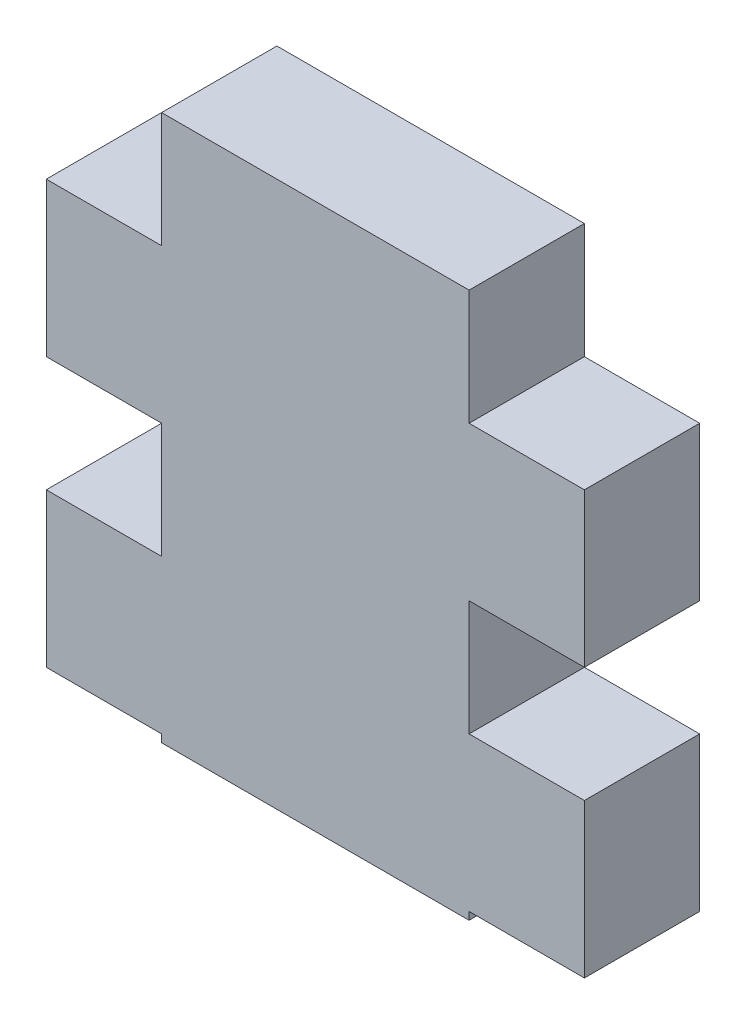
ISO-10303-21;
HEADER;
FILE_DESCRIPTION(('STEP AP214'),'2;1');
FILE_NAME('part.step','',(''),(''),'','','');
FILE_SCHEMA(('AUTOMOTIVE_DESIGN { 1 0 10303 214 1 1 1 1 }'));
ENDSEC;
DATA;
#1=APPLICATION_CONTEXT('core data for automotive mechanical design processes');
#2=APPLICATION_PROTOCOL_DEFINITION('international standard','automotive_design',2000,#1);
#3=PRODUCT_CONTEXT('',#1,'mechanical');
#4=PRODUCT('Part','Part','',(#3));
#5=PRODUCT_RELATED_PRODUCT_CATEGORY('part','',(#4));
#6=PRODUCT_DEFINITION_FORMATION('','',#4);
#7=PRODUCT_DEFINITION_CONTEXT('part definition',#1,'design');
#8=PRODUCT_DEFINITION('design','',#6,#7);
#9=PRODUCT_DEFINITION_SHAPE('','',#8);
#10=(LENGTH_UNIT() NAMED_UNIT(*) SI_UNIT(.MILLI.,.METRE.));
#11=(NAMED_UNIT(*) PLANE_ANGLE_UNIT() SI_UNIT($,.RADIAN.));
#12=(NAMED_UNIT(*) SI_UNIT($,.STERADIAN.) SOLID_ANGLE_UNIT());
#13=UNCERTAINTY_MEASURE_WITH_UNIT(LENGTH_MEASURE(1.E-05),#10,'distance_accuracy_value','');
#14=(GEOMETRIC_REPRESENTATION_CONTEXT(3) GLOBAL_UNCERTAINTY_ASSIGNED_CONTEXT((#13)) GLOBAL_UNIT_ASSIGNED_CONTEXT((#10,
#11,#12)) REPRESENTATION_CONTEXT('',''));
#15=CARTESIAN_POINT('',(0.,0.,0.));
#16=DIRECTION('',(0.,0.,1.));
#17=DIRECTION('',(1.,0.,0.));
#18=AXIS2_PLACEMENT_3D('',#15,#16,#17);
#19=CARTESIAN_POINT('',(7.,-7.1,3.));
#20=DIRECTION('',(-1.,0.,0.));
#21=DIRECTION('',(0.,0.,1.));
#22=AXIS2_PLACEMENT_3D('',#19,#20,#21);
#23=PLANE('',#22);
#24=DIRECTION('',(0.,1.,0.));
#25=VECTOR('',#24,1.);
#26=CARTESIAN_POINT('',(7.,-7.1,0.));
#27=LINE('',#26,#25);
#28=CARTESIAN_POINT('',(7.,-6.9,0.));
#29=VERTEX_POINT('',#28);
#30=CARTESIAN_POINT('',(7.,-2.9,0.));
#31=VERTEX_POINT('',#30);
#32=EDGE_CURVE('E215',#29,#31,#27,.T.);
#33=ORIENTED_EDGE('',*,*,#32,.T.);
#34=DIRECTION('',(0.,0.,1.));
#35=VECTOR('',#34,1.);
#36=CARTESIAN_POINT('',(7.,-2.9,-7.));
#37=LINE('',#36,#35);
#38=CARTESIAN_POINT('',(7.,-2.9,3.));
#39=VERTEX_POINT('',#38);
#40=EDGE_CURVE('E258',#31,#39,#37,.T.);
#41=ORIENTED_EDGE('',*,*,#40,.T.);
#42=DIRECTION('',(0.,1.,0.));
#43=VECTOR('',#42,1.);
#44=CARTESIAN_POINT('',(7.,-7.1,3.));
#45=LINE('',#44,#43);
#46=CARTESIAN_POINT('',(7.,-6.9,3.));
#47=VERTEX_POINT('',#46);
#48=EDGE_CURVE('E198',#47,#39,#45,.T.);
#49=ORIENTED_EDGE('',*,*,#48,.F.);
#50=DIRECTION('',(0.,0.,1.));
#51=VECTOR('',#50,1.);
#52=CARTESIAN_POINT('',(7.,-6.9,-7.));
#53=LINE('',#52,#51);
#54=EDGE_CURVE('E290',#29,#47,#53,.T.);
#55=ORIENTED_EDGE('',*,*,#54,.F.);
#56=EDGE_LOOP('',(#33,#41,#49,#55));
#57=FACE_BOUND('',#56,.T.);
#58=ADVANCED_FACE('F40',(#57),#23,.F.);
#59=CARTESIAN_POINT('',(-7.,-7.1,3.));
#60=DIRECTION('',(1.,0.,0.));
#61=DIRECTION('',(0.,0.,-1.));
#62=AXIS2_PLACEMENT_3D('',#59,#60,#61);
#63=PLANE('',#62);
#64=DIRECTION('',(0.,-1.,0.));
#65=VECTOR('',#64,1.);
#66=CARTESIAN_POINT('',(-7.,-7.1,3.));
#67=LINE('',#66,#65);
#68=CARTESIAN_POINT('',(-7.,4.1,3.));
#69=VERTEX_POINT('',#68);
#70=CARTESIAN_POINT('',(-7.,0.0999999999999985,3.));
#71=VERTEX_POINT('',#70);
#72=EDGE_CURVE('E201',#69,#71,#67,.T.);
#73=ORIENTED_EDGE('',*,*,#72,.F.);
#74=DIRECTION('',(0.,0.,1.));
#75=VECTOR('',#74,1.);
#76=CARTESIAN_POINT('',(-7.,4.1,-7.));
#77=LINE('',#76,#75);
#78=CARTESIAN_POINT('',(-7.,4.1,0.));
#79=VERTEX_POINT('',#78);
#80=EDGE_CURVE('E307',#79,#69,#77,.T.);
#81=ORIENTED_EDGE('',*,*,#80,.F.);
#82=DIRECTION('',(0.,-1.,0.));
#83=VECTOR('',#82,1.);
#84=CARTESIAN_POINT('',(-7.,-7.1,0.));
#85=LINE('',#84,#83);
#86=CARTESIAN_POINT('',(-7.,0.0999999999999985,0.));
#87=VERTEX_POINT('',#86);
#88=EDGE_CURVE('E221',#79,#87,#85,.T.);
#89=ORIENTED_EDGE('',*,*,#88,.T.);
#90=DIRECTION('',(0.,0.,1.));
#91=VECTOR('',#90,1.);
#92=CARTESIAN_POINT('',(-7.,0.0999999999999985,-7.));
#93=LINE('',#92,#91);
#94=EDGE_CURVE('E319',#87,#71,#93,.T.);
#95=ORIENTED_EDGE('',*,*,#94,.T.);
#96=EDGE_LOOP('',(#73,#81,#89,#95));
#97=FACE_BOUND('',#96,.T.);
#98=ADVANCED_FACE('F372',(#97),#63,.F.);
#99=CARTESIAN_POINT('',(7.,0.0999999999999985,0.));
#100=VERTEX_POINT('',#99);
#101=CARTESIAN_POINT('',(7.,4.1,0.));
#102=VERTEX_POINT('',#101);
#103=EDGE_CURVE('E212',#100,#102,#27,.T.);
#104=ORIENTED_EDGE('',*,*,#103,.T.);
#105=DIRECTION('',(0.,0.,1.));
#106=VECTOR('',#105,1.);
#107=CARTESIAN_POINT('',(7.,4.1,-7.));
#108=LINE('',#107,#106);
#109=CARTESIAN_POINT('',(7.,4.1,3.));
#110=VERTEX_POINT('',#109);
#111=EDGE_CURVE('E337',#102,#110,#108,.T.);
#112=ORIENTED_EDGE('',*,*,#111,.T.);
#113=CARTESIAN_POINT('',(7.,0.0999999999999985,3.));
#114=VERTEX_POINT('',#113);
#115=EDGE_CURVE('E204',#114,#110,#45,.T.);
#116=ORIENTED_EDGE('',*,*,#115,.F.);
#117=DIRECTION('',(0.,0.,1.));
#118=VECTOR('',#117,1.);
#119=CARTESIAN_POINT('',(7.,0.0999999999999985,-7.));
#120=LINE('',#119,#118);
#121=EDGE_CURVE('E275',#100,#114,#120,.T.);
#122=ORIENTED_EDGE('',*,*,#121,.F.);
#123=EDGE_LOOP('',(#104,#112,#116,#122));
#124=FACE_BOUND('',#123,.T.);
#125=ADVANCED_FACE('F42',(#124),#23,.F.);
#126=CARTESIAN_POINT('',(-7.,7.1,3.));
#127=DIRECTION('',(0.,-1.,0.));
#128=DIRECTION('',(0.,0.,-1.));
#129=AXIS2_PLACEMENT_3D('',#126,#127,#128);
#130=PLANE('',#129);
#131=DIRECTION('',(-1.,0.,0.));
#132=VECTOR('',#131,1.);
#133=CARTESIAN_POINT('',(-7.,7.1,3.));
#134=LINE('',#133,#132);
#135=CARTESIAN_POINT('',(4.,7.1,3.));
#136=VERTEX_POINT('',#135);
#137=CARTESIAN_POINT('',(-4.,7.1,3.));
#138=VERTEX_POINT('',#137);
#139=EDGE_CURVE('E189',#136,#138,#134,.T.);
#140=ORIENTED_EDGE('',*,*,#139,.F.);
#141=DIRECTION('',(0.,0.,1.));
#142=VECTOR('',#141,1.);
#143=CARTESIAN_POINT('',(4.,7.1,-7.));
#144=LINE('',#143,#142);
#145=CARTESIAN_POINT('',(4.,7.1,0.));
#146=VERTEX_POINT('',#145);
#147=EDGE_CURVE('E174',#146,#136,#144,.T.);
#148=ORIENTED_EDGE('',*,*,#147,.F.);
#149=DIRECTION('',(-1.,0.,0.));
#150=VECTOR('',#149,1.);
#151=CARTESIAN_POINT('',(-7.,7.1,0.));
#152=LINE('',#151,#150);
#153=CARTESIAN_POINT('',(-4.,7.1,0.));
#154=VERTEX_POINT('',#153);
#155=EDGE_CURVE('E216',#146,#154,#152,.T.);
#156=ORIENTED_EDGE('',*,*,#155,.T.);
#157=DIRECTION('',(0.,0.,1.));
#158=VECTOR('',#157,1.);
#159=CARTESIAN_POINT('',(-4.,7.1,-7.));
#160=LINE('',#159,#158);
#161=EDGE_CURVE('E196',#154,#138,#160,.T.);
#162=ORIENTED_EDGE('',*,*,#161,.T.);
#163=EDGE_LOOP('',(#140,#148,#156,#162));
#164=FACE_BOUND('',#163,.T.);
#165=ADVANCED_FACE('F194',(#164),#130,.F.);
#166=CARTESIAN_POINT('',(-7.,-2.9,3.));
#167=VERTEX_POINT('',#166);
#168=CARTESIAN_POINT('',(-7.,-6.9,3.));
#169=VERTEX_POINT('',#168);
#170=EDGE_CURVE('E197',#167,#169,#67,.T.);
#171=ORIENTED_EDGE('',*,*,#170,.F.);
#172=DIRECTION('',(0.,0.,1.));
#173=VECTOR('',#172,1.);
#174=CARTESIAN_POINT('',(-7.,-2.9,-7.));
#175=LINE('',#174,#173);
#176=CARTESIAN_POINT('',(-7.,-2.9,0.));
#177=VERTEX_POINT('',#176);
#178=EDGE_CURVE('E312',#177,#167,#175,.T.);
#179=ORIENTED_EDGE('',*,*,#178,.F.);
#180=CARTESIAN_POINT('',(-7.,-6.9,0.));
#181=VERTEX_POINT('',#180);
#182=EDGE_CURVE('E218',#177,#181,#85,.T.);
#183=ORIENTED_EDGE('',*,*,#182,.T.);
#184=DIRECTION('',(0.,0.,1.));
#185=VECTOR('',#184,1.);
#186=CARTESIAN_POINT('',(-7.,-6.9,-7.));
#187=LINE('',#186,#185);
#188=EDGE_CURVE('E334',#181,#169,#187,.T.);
#189=ORIENTED_EDGE('',*,*,#188,.T.);
#190=EDGE_LOOP('',(#171,#179,#183,#189));
#191=FACE_BOUND('',#190,.T.);
#192=ADVANCED_FACE('F351',(#191),#63,.F.);
#193=CARTESIAN_POINT('',(-7.,-7.1,3.));
#194=DIRECTION('',(0.,1.,0.));
#195=DIRECTION('',(0.,0.,1.));
#196=AXIS2_PLACEMENT_3D('',#193,#194,#195);
#197=PLANE('',#196);
#198=DIRECTION('',(1.,0.,0.));
#199=VECTOR('',#198,1.);
#200=CARTESIAN_POINT('',(-7.,-7.1,0.));
#201=LINE('',#200,#199);
#202=CARTESIAN_POINT('',(-4.,-7.1,0.));
#203=VERTEX_POINT('',#202);
#204=CARTESIAN_POINT('',(4.,-7.1,0.));
#205=VERTEX_POINT('',#204);
#206=EDGE_CURVE('E222',#203,#205,#201,.T.);
#207=ORIENTED_EDGE('',*,*,#206,.T.);
#208=DIRECTION('',(0.,0.,1.));
#209=VECTOR('',#208,1.);
#210=CARTESIAN_POINT('',(4.,-7.1,-7.));
#211=LINE('',#210,#209);
#212=CARTESIAN_POINT('',(4.,-7.1,3.));
#213=VERTEX_POINT('',#212);
#214=EDGE_CURVE('E295',#205,#213,#211,.T.);
#215=ORIENTED_EDGE('',*,*,#214,.T.);
#216=DIRECTION('',(1.,0.,0.));
#217=VECTOR('',#216,1.);
#218=CARTESIAN_POINT('',(-7.,-7.1,3.));
#219=LINE('',#218,#217);
#220=CARTESIAN_POINT('',(-4.,-7.1,3.));
#221=VERTEX_POINT('',#220);
#222=EDGE_CURVE('E208',#221,#213,#219,.T.);
#223=ORIENTED_EDGE('',*,*,#222,.F.);
#224=DIRECTION('',(0.,0.,1.));
#225=VECTOR('',#224,1.);
#226=CARTESIAN_POINT('',(-4.,-7.1,-7.));
#227=LINE('',#226,#225);
#228=EDGE_CURVE('E329',#203,#221,#227,.T.);
#229=ORIENTED_EDGE('',*,*,#228,.F.);
#230=EDGE_LOOP('',(#207,#215,#223,#229));
#231=FACE_BOUND('',#230,.T.);
#232=ADVANCED_FACE('F360',(#231),#197,.F.);
#233=CARTESIAN_POINT('',(0.,0.,3.));
#234=DIRECTION('',(0.,0.,-1.));
#235=DIRECTION('',(-1.,0.,0.));
#236=AXIS2_PLACEMENT_3D('',#233,#234,#235);
#237=PLANE('',#236);
#238=ORIENTED_EDGE('',*,*,#115,.T.);
#239=DIRECTION('',(1.,0.,0.));
#240=VECTOR('',#239,1.);
#241=CARTESIAN_POINT('',(7.,4.1,3.));
#242=LINE('',#241,#240);
#243=CARTESIAN_POINT('',(4.,4.1,3.));
#244=VERTEX_POINT('',#243);
#245=EDGE_CURVE('E183',#244,#110,#242,.T.);
#246=ORIENTED_EDGE('',*,*,#245,.F.);
#247=DIRECTION('',(0.,-1.,0.));
#248=VECTOR('',#247,1.);
#249=CARTESIAN_POINT('',(4.,4.1,3.));
#250=LINE('',#249,#248);
#251=EDGE_CURVE('E177',#136,#244,#250,.T.);
#252=ORIENTED_EDGE('',*,*,#251,.F.);
#253=ORIENTED_EDGE('',*,*,#139,.T.);
#254=DIRECTION('',(0.,1.,0.));
#255=VECTOR('',#254,1.);
#256=CARTESIAN_POINT('',(-4.,4.1,3.));
#257=LINE('',#256,#255);
#258=CARTESIAN_POINT('',(-4.,4.1,3.));
#259=VERTEX_POINT('',#258);
#260=EDGE_CURVE('E304',#259,#138,#257,.T.);
#261=ORIENTED_EDGE('',*,*,#260,.F.);
#262=DIRECTION('',(1.,0.,0.));
#263=VECTOR('',#262,1.);
#264=CARTESIAN_POINT('',(-7.,4.1,3.));
#265=LINE('',#264,#263);
#266=EDGE_CURVE('E301',#69,#259,#265,.T.);
#267=ORIENTED_EDGE('',*,*,#266,.F.);
#268=ORIENTED_EDGE('',*,*,#72,.T.);
#269=DIRECTION('',(-1.,0.,0.));
#270=VECTOR('',#269,1.);
#271=CARTESIAN_POINT('',(-7.,0.0999999999999985,3.));
#272=LINE('',#271,#270);
#273=CARTESIAN_POINT('',(-4.,0.0999999999999985,3.));
#274=VERTEX_POINT('',#273);
#275=EDGE_CURVE('E314',#274,#71,#272,.T.);
#276=ORIENTED_EDGE('',*,*,#275,.F.);
#277=DIRECTION('',(0.,1.,0.));
#278=VECTOR('',#277,1.);
#279=CARTESIAN_POINT('',(-4.,0.0999999999999985,3.));
#280=LINE('',#279,#278);
#281=CARTESIAN_POINT('',(-4.,-2.9,3.));
#282=VERTEX_POINT('',#281);
#283=EDGE_CURVE('E324',#282,#274,#280,.T.);
#284=ORIENTED_EDGE('',*,*,#283,.F.);
#285=DIRECTION('',(1.,0.,0.));
#286=VECTOR('',#285,1.);
#287=CARTESIAN_POINT('',(-7.,-2.9,3.));
#288=LINE('',#287,#286);
#289=EDGE_CURVE('E305',#167,#282,#288,.T.);
#290=ORIENTED_EDGE('',*,*,#289,.F.);
#291=ORIENTED_EDGE('',*,*,#170,.T.);
#292=DIRECTION('',(-1.,0.,0.));
#293=VECTOR('',#292,1.);
#294=CARTESIAN_POINT('',(-7.,-6.9,3.));
#295=LINE('',#294,#293);
#296=CARTESIAN_POINT('',(-4.,-6.9,3.));
#297=VERTEX_POINT('',#296);
#298=EDGE_CURVE('E331',#297,#169,#295,.T.);
#299=ORIENTED_EDGE('',*,*,#298,.F.);
#300=DIRECTION('',(0.,1.,0.));
#301=VECTOR('',#300,1.);
#302=CARTESIAN_POINT('',(-4.,-6.9,3.));
#303=LINE('',#302,#301);
#304=EDGE_CURVE('E322',#221,#297,#303,.T.);
#305=ORIENTED_EDGE('',*,*,#304,.F.);
#306=ORIENTED_EDGE('',*,*,#222,.T.);
#307=DIRECTION('',(0.,-1.,0.));
#308=VECTOR('',#307,1.);
#309=CARTESIAN_POINT('',(4.,-6.9,3.));
#310=LINE('',#309,#308);
#311=CARTESIAN_POINT('',(4.,-6.9,3.));
#312=VERTEX_POINT('',#311);
#313=EDGE_CURVE('E292',#312,#213,#310,.T.);
#314=ORIENTED_EDGE('',*,*,#313,.F.);
#315=DIRECTION('',(-1.,0.,0.));
#316=VECTOR('',#315,1.);
#317=CARTESIAN_POINT('',(7.,-6.9,3.));
#318=LINE('',#317,#316);
#319=EDGE_CURVE('E286',#47,#312,#318,.T.);
#320=ORIENTED_EDGE('',*,*,#319,.F.);
#321=ORIENTED_EDGE('',*,*,#48,.T.);
#322=DIRECTION('',(1.,0.,0.));
#323=VECTOR('',#322,1.);
#324=CARTESIAN_POINT('',(7.,-2.9,3.));
#325=LINE('',#324,#323);
#326=CARTESIAN_POINT('',(4.,-2.9,3.));
#327=VERTEX_POINT('',#326);
#328=EDGE_CURVE('E280',#327,#39,#325,.T.);
#329=ORIENTED_EDGE('',*,*,#328,.F.);
#330=DIRECTION('',(0.,-1.,0.));
#331=VECTOR('',#330,1.);
#332=CARTESIAN_POINT('',(4.,0.0999999999999981,3.));
#333=LINE('',#332,#331);
#334=CARTESIAN_POINT('',(4.,0.0999999999999981,3.));
#335=VERTEX_POINT('',#334);
#336=EDGE_CURVE('E267',#335,#327,#333,.T.);
#337=ORIENTED_EDGE('',*,*,#336,.F.);
#338=DIRECTION('',(-1.,0.,0.));
#339=VECTOR('',#338,1.);
#340=CARTESIAN_POINT('',(7.,0.0999999999999985,3.));
#341=LINE('',#340,#339);
#342=EDGE_CURVE('E191',#114,#335,#341,.T.);
#343=ORIENTED_EDGE('',*,*,#342,.F.);
#344=EDGE_LOOP('',(#238,#246,#252,#253,#261,#267,#268,#276,#284,#290,#291,#299,#305,#306,#314,
#320,#321,#329,#337,#343));
#345=FACE_BOUND('',#344,.T.);
#346=ADVANCED_FACE('F187',(#345),#237,.F.);
#347=CARTESIAN_POINT('',(0.,0.,0.));
#348=DIRECTION('',(0.,0.,-1.));
#349=DIRECTION('',(-1.,0.,0.));
#350=AXIS2_PLACEMENT_3D('',#347,#348,#349);
#351=PLANE('',#350);
#352=DIRECTION('',(-1.,0.,0.));
#353=VECTOR('',#352,1.);
#354=CARTESIAN_POINT('',(0.,4.1,0.));
#355=LINE('',#354,#353);
#356=CARTESIAN_POINT('',(4.,4.1,0.));
#357=VERTEX_POINT('',#356);
#358=EDGE_CURVE('E12',#102,#357,#355,.T.);
#359=ORIENTED_EDGE('',*,*,#358,.F.);
#360=ORIENTED_EDGE('',*,*,#103,.F.);
#361=DIRECTION('',(1.,0.,0.));
#362=VECTOR('',#361,1.);
#363=CARTESIAN_POINT('',(0.,0.0999999999999976,0.));
#364=LINE('',#363,#362);
#365=CARTESIAN_POINT('',(4.,0.0999999999999981,0.));
#366=VERTEX_POINT('',#365);
#367=EDGE_CURVE('E246',#366,#100,#364,.T.);
#368=ORIENTED_EDGE('',*,*,#367,.F.);
#369=DIRECTION('',(0.,1.,0.));
#370=VECTOR('',#369,1.);
#371=CARTESIAN_POINT('',(4.,0.,0.));
#372=LINE('',#371,#370);
#373=CARTESIAN_POINT('',(4.,-2.9,0.));
#374=VERTEX_POINT('',#373);
#375=EDGE_CURVE('E248',#374,#366,#372,.T.);
#376=ORIENTED_EDGE('',*,*,#375,.F.);
#377=DIRECTION('',(-1.,0.,0.));
#378=VECTOR('',#377,1.);
#379=CARTESIAN_POINT('',(0.,-2.9,0.));
#380=LINE('',#379,#378);
#381=EDGE_CURVE('E250',#31,#374,#380,.T.);
#382=ORIENTED_EDGE('',*,*,#381,.F.);
#383=ORIENTED_EDGE('',*,*,#32,.F.);
#384=DIRECTION('',(1.,0.,0.));
#385=VECTOR('',#384,1.);
#386=CARTESIAN_POINT('',(0.,-6.9,0.));
#387=LINE('',#386,#385);
#388=CARTESIAN_POINT('',(4.,-6.9,0.));
#389=VERTEX_POINT('',#388);
#390=EDGE_CURVE('E241',#389,#29,#387,.T.);
#391=ORIENTED_EDGE('',*,*,#390,.F.);
#392=DIRECTION('',(0.,1.,0.));
#393=VECTOR('',#392,1.);
#394=CARTESIAN_POINT('',(4.,0.,0.));
#395=LINE('',#394,#393);
#396=EDGE_CURVE('E243',#205,#389,#395,.T.);
#397=ORIENTED_EDGE('',*,*,#396,.F.);
#398=ORIENTED_EDGE('',*,*,#206,.F.);
#399=DIRECTION('',(0.,-1.,0.));
#400=VECTOR('',#399,1.);
#401=CARTESIAN_POINT('',(-4.,0.,0.));
#402=LINE('',#401,#400);
#403=CARTESIAN_POINT('',(-4.,-6.9,0.));
#404=VERTEX_POINT('',#403);
#405=EDGE_CURVE('E211',#404,#203,#402,.T.);
#406=ORIENTED_EDGE('',*,*,#405,.F.);
#407=DIRECTION('',(1.,0.,0.));
#408=VECTOR('',#407,1.);
#409=CARTESIAN_POINT('',(0.,-6.9,0.));
#410=LINE('',#409,#408);
#411=EDGE_CURVE('E226',#181,#404,#410,.T.);
#412=ORIENTED_EDGE('',*,*,#411,.F.);
#413=ORIENTED_EDGE('',*,*,#182,.F.);
#414=DIRECTION('',(-1.,0.,0.));
#415=VECTOR('',#414,1.);
#416=CARTESIAN_POINT('',(0.,-2.9,0.));
#417=LINE('',#416,#415);
#418=CARTESIAN_POINT('',(-4.,-2.9,0.));
#419=VERTEX_POINT('',#418);
#420=EDGE_CURVE('E229',#419,#177,#417,.T.);
#421=ORIENTED_EDGE('',*,*,#420,.F.);
#422=DIRECTION('',(0.,-1.,0.));
#423=VECTOR('',#422,1.);
#424=CARTESIAN_POINT('',(-4.,0.,0.));
#425=LINE('',#424,#423);
#426=CARTESIAN_POINT('',(-4.,0.0999999999999985,0.));
#427=VERTEX_POINT('',#426);
#428=EDGE_CURVE('E231',#427,#419,#425,.T.);
#429=ORIENTED_EDGE('',*,*,#428,.F.);
#430=DIRECTION('',(1.,0.,0.));
#431=VECTOR('',#430,1.);
#432=CARTESIAN_POINT('',(0.,0.0999999999999985,0.));
#433=LINE('',#432,#431);
#434=EDGE_CURVE('E234',#87,#427,#433,.T.);
#435=ORIENTED_EDGE('',*,*,#434,.F.);
#436=ORIENTED_EDGE('',*,*,#88,.F.);
#437=DIRECTION('',(-1.,0.,0.));
#438=VECTOR('',#437,1.);
#439=CARTESIAN_POINT('',(0.,4.1,0.));
#440=LINE('',#439,#438);
#441=CARTESIAN_POINT('',(-4.,4.1,0.));
#442=VERTEX_POINT('',#441);
#443=EDGE_CURVE('E236',#442,#79,#440,.T.);
#444=ORIENTED_EDGE('',*,*,#443,.F.);
#445=DIRECTION('',(0.,-1.,0.));
#446=VECTOR('',#445,1.);
#447=CARTESIAN_POINT('',(-4.,0.,0.));
#448=LINE('',#447,#446);
#449=EDGE_CURVE('E238',#154,#442,#448,.T.);
#450=ORIENTED_EDGE('',*,*,#449,.F.);
#451=ORIENTED_EDGE('',*,*,#155,.F.);
#452=DIRECTION('',(0.,1.,0.));
#453=VECTOR('',#452,1.);
#454=CARTESIAN_POINT('',(4.,0.,0.));
#455=LINE('',#454,#453);
#456=EDGE_CURVE('E48',#357,#146,#455,.T.);
#457=ORIENTED_EDGE('',*,*,#456,.F.);
#458=EDGE_LOOP('',(#359,#360,#368,#376,#382,#383,#391,#397,#398,#406,#412,#413,#421,#429,#435,
#436,#444,#450,#451,#457));
#459=FACE_BOUND('',#458,.T.);
#460=ADVANCED_FACE('F271',(#459),#351,.T.);
#461=CARTESIAN_POINT('',(-7.,-6.9,-7.));
#462=DIRECTION('',(0.,1.,0.));
#463=DIRECTION('',(-1.,0.,0.));
#464=AXIS2_PLACEMENT_3D('',#461,#462,#463);
#465=PLANE('',#464);
#466=ORIENTED_EDGE('',*,*,#411,.T.);
#467=DIRECTION('',(0.,0.,1.));
#468=VECTOR('',#467,1.);
#469=CARTESIAN_POINT('',(-4.,-6.9,-7.));
#470=LINE('',#469,#468);
#471=EDGE_CURVE('E332',#404,#297,#470,.T.);
#472=ORIENTED_EDGE('',*,*,#471,.T.);
#473=ORIENTED_EDGE('',*,*,#298,.T.);
#474=ORIENTED_EDGE('',*,*,#188,.F.);
#475=EDGE_LOOP('',(#466,#472,#473,#474));
#476=FACE_BOUND('',#475,.T.);
#477=ADVANCED_FACE('F348',(#476),#465,.F.);
#478=CARTESIAN_POINT('',(-4.,-6.9,-7.));
#479=DIRECTION('',(1.,0.,0.));
#480=DIRECTION('',(0.,0.,-1.));
#481=AXIS2_PLACEMENT_3D('',#478,#479,#480);
#482=PLANE('',#481);
#483=ORIENTED_EDGE('',*,*,#405,.T.);
#484=ORIENTED_EDGE('',*,*,#228,.T.);
#485=ORIENTED_EDGE('',*,*,#304,.T.);
#486=ORIENTED_EDGE('',*,*,#471,.F.);
#487=EDGE_LOOP('',(#483,#484,#485,#486));
#488=FACE_BOUND('',#487,.T.);
#489=ADVANCED_FACE('F342',(#488),#482,.F.);
#490=CARTESIAN_POINT('',(-7.,0.0999999999999985,-7.));
#491=DIRECTION('',(0.,1.,0.));
#492=DIRECTION('',(0.,0.,1.));
#493=AXIS2_PLACEMENT_3D('',#490,#491,#492);
#494=PLANE('',#493);
#495=ORIENTED_EDGE('',*,*,#434,.T.);
#496=DIRECTION('',(0.,0.,1.));
#497=VECTOR('',#496,1.);
#498=CARTESIAN_POINT('',(-4.,0.0999999999999985,-7.));
#499=LINE('',#498,#497);
#500=EDGE_CURVE('E317',#427,#274,#499,.T.);
#501=ORIENTED_EDGE('',*,*,#500,.T.);
#502=ORIENTED_EDGE('',*,*,#275,.T.);
#503=ORIENTED_EDGE('',*,*,#94,.F.);
#504=EDGE_LOOP('',(#495,#501,#502,#503));
#505=FACE_BOUND('',#504,.T.);
#506=ADVANCED_FACE('F397',(#505),#494,.F.);
#507=CARTESIAN_POINT('',(-4.,0.0999999999999985,-7.));
#508=DIRECTION('',(1.,0.,0.));
#509=DIRECTION('',(0.,0.,-1.));
#510=AXIS2_PLACEMENT_3D('',#507,#508,#509);
#511=PLANE('',#510);
#512=ORIENTED_EDGE('',*,*,#428,.T.);
#513=DIRECTION('',(0.,0.,1.));
#514=VECTOR('',#513,1.);
#515=CARTESIAN_POINT('',(-4.,-2.9,-7.));
#516=LINE('',#515,#514);
#517=EDGE_CURVE('E315',#419,#282,#516,.T.);
#518=ORIENTED_EDGE('',*,*,#517,.T.);
#519=ORIENTED_EDGE('',*,*,#283,.T.);
#520=ORIENTED_EDGE('',*,*,#500,.F.);
#521=EDGE_LOOP('',(#512,#518,#519,#520));
#522=FACE_BOUND('',#521,.T.);
#523=ADVANCED_FACE('F400',(#522),#511,.F.);
#524=CARTESIAN_POINT('',(-7.,-2.9,-7.));
#525=DIRECTION('',(0.,-1.,0.));
#526=DIRECTION('',(0.,0.,-1.));
#527=AXIS2_PLACEMENT_3D('',#524,#525,#526);
#528=PLANE('',#527);
#529=ORIENTED_EDGE('',*,*,#420,.T.);
#530=ORIENTED_EDGE('',*,*,#178,.T.);
#531=ORIENTED_EDGE('',*,*,#289,.T.);
#532=ORIENTED_EDGE('',*,*,#517,.F.);
#533=EDGE_LOOP('',(#529,#530,#531,#532));
#534=FACE_BOUND('',#533,.T.);
#535=ADVANCED_FACE('F404',(#534),#528,.F.);
#536=CARTESIAN_POINT('',(-4.,4.1,-7.));
#537=DIRECTION('',(1.,0.,0.));
#538=DIRECTION('',(0.,0.,-1.));
#539=AXIS2_PLACEMENT_3D('',#536,#537,#538);
#540=PLANE('',#539);
#541=ORIENTED_EDGE('',*,*,#449,.T.);
#542=DIRECTION('',(0.,0.,1.));
#543=VECTOR('',#542,1.);
#544=CARTESIAN_POINT('',(-4.,4.1,-7.));
#545=LINE('',#544,#543);
#546=EDGE_CURVE('E309',#442,#259,#545,.T.);
#547=ORIENTED_EDGE('',*,*,#546,.T.);
#548=ORIENTED_EDGE('',*,*,#260,.T.);
#549=ORIENTED_EDGE('',*,*,#161,.F.);
#550=EDGE_LOOP('',(#541,#547,#548,#549));
#551=FACE_BOUND('',#550,.T.);
#552=ADVANCED_FACE('F408',(#551),#540,.F.);
#553=CARTESIAN_POINT('',(-7.,4.1,-7.));
#554=DIRECTION('',(0.,-1.,0.));
#555=DIRECTION('',(0.,0.,-1.));
#556=AXIS2_PLACEMENT_3D('',#553,#554,#555);
#557=PLANE('',#556);
#558=ORIENTED_EDGE('',*,*,#443,.T.);
#559=ORIENTED_EDGE('',*,*,#80,.T.);
#560=ORIENTED_EDGE('',*,*,#266,.T.);
#561=ORIENTED_EDGE('',*,*,#546,.F.);
#562=EDGE_LOOP('',(#558,#559,#560,#561));
#563=FACE_BOUND('',#562,.T.);
#564=ADVANCED_FACE('F410',(#563),#557,.F.);
#565=CARTESIAN_POINT('',(4.,-6.9,-7.));
#566=DIRECTION('',(-1.,0.,0.));
#567=DIRECTION('',(0.,0.,1.));
#568=AXIS2_PLACEMENT_3D('',#565,#566,#567);
#569=PLANE('',#568);
#570=ORIENTED_EDGE('',*,*,#396,.T.);
#571=DIRECTION('',(0.,0.,1.));
#572=VECTOR('',#571,1.);
#573=CARTESIAN_POINT('',(4.,-6.9,-7.));
#574=LINE('',#573,#572);
#575=EDGE_CURVE('E293',#389,#312,#574,.T.);
#576=ORIENTED_EDGE('',*,*,#575,.T.);
#577=ORIENTED_EDGE('',*,*,#313,.T.);
#578=ORIENTED_EDGE('',*,*,#214,.F.);
#579=EDGE_LOOP('',(#570,#576,#577,#578));
#580=FACE_BOUND('',#579,.T.);
#581=ADVANCED_FACE('F365',(#580),#569,.F.);
#582=CARTESIAN_POINT('',(7.,-6.9,-7.));
#583=DIRECTION('',(0.,1.,0.));
#584=DIRECTION('',(0.,0.,1.));
#585=AXIS2_PLACEMENT_3D('',#582,#583,#584);
#586=PLANE('',#585);
#587=ORIENTED_EDGE('',*,*,#390,.T.);
#588=ORIENTED_EDGE('',*,*,#54,.T.);
#589=ORIENTED_EDGE('',*,*,#319,.T.);
#590=ORIENTED_EDGE('',*,*,#575,.F.);
#591=EDGE_LOOP('',(#587,#588,#589,#590));
#592=FACE_BOUND('',#591,.T.);
#593=ADVANCED_FACE('F368',(#592),#586,.F.);
#594=CARTESIAN_POINT('',(7.,-2.9,-7.));
#595=DIRECTION('',(0.,-1.,0.));
#596=DIRECTION('',(0.,0.,-1.));
#597=AXIS2_PLACEMENT_3D('',#594,#595,#596);
#598=PLANE('',#597);
#599=ORIENTED_EDGE('',*,*,#381,.T.);
#600=DIRECTION('',(0.,0.,1.));
#601=VECTOR('',#600,1.);
#602=CARTESIAN_POINT('',(4.,-2.9,-7.));
#603=LINE('',#602,#601);
#604=EDGE_CURVE('E255',#374,#327,#603,.T.);
#605=ORIENTED_EDGE('',*,*,#604,.T.);
#606=ORIENTED_EDGE('',*,*,#328,.T.);
#607=ORIENTED_EDGE('',*,*,#40,.F.);
#608=EDGE_LOOP('',(#599,#605,#606,#607));
#609=FACE_BOUND('',#608,.T.);
#610=ADVANCED_FACE('F254',(#609),#598,.F.);
#611=CARTESIAN_POINT('',(4.,0.0999999999999981,-7.));
#612=DIRECTION('',(-1.,0.,0.));
#613=DIRECTION('',(0.,-1.,0.));
#614=AXIS2_PLACEMENT_3D('',#611,#612,#613);
#615=PLANE('',#614);
#616=ORIENTED_EDGE('',*,*,#375,.T.);
#617=DIRECTION('',(0.,0.,1.));
#618=VECTOR('',#617,1.);
#619=CARTESIAN_POINT('',(4.,0.0999999999999981,-7.));
#620=LINE('',#619,#618);
#621=EDGE_CURVE('E62',#366,#335,#620,.T.);
#622=ORIENTED_EDGE('',*,*,#621,.T.);
#623=ORIENTED_EDGE('',*,*,#336,.T.);
#624=ORIENTED_EDGE('',*,*,#604,.F.);
#625=EDGE_LOOP('',(#616,#622,#623,#624));
#626=FACE_BOUND('',#625,.T.);
#627=ADVANCED_FACE('F264',(#626),#615,.F.);
#628=CARTESIAN_POINT('',(7.,0.0999999999999985,-7.));
#629=DIRECTION('',(0.,1.,0.));
#630=DIRECTION('',(-1.,0.,0.));
#631=AXIS2_PLACEMENT_3D('',#628,#629,#630);
#632=PLANE('',#631);
#633=ORIENTED_EDGE('',*,*,#367,.T.);
#634=ORIENTED_EDGE('',*,*,#121,.T.);
#635=ORIENTED_EDGE('',*,*,#342,.T.);
#636=ORIENTED_EDGE('',*,*,#621,.F.);
#637=EDGE_LOOP('',(#633,#634,#635,#636));
#638=FACE_BOUND('',#637,.T.);
#639=ADVANCED_FACE('F274',(#638),#632,.F.);
#640=CARTESIAN_POINT('',(7.,4.1,-7.));
#641=DIRECTION('',(0.,-1.,0.));
#642=DIRECTION('',(0.,0.,-1.));
#643=AXIS2_PLACEMENT_3D('',#640,#641,#642);
#644=PLANE('',#643);
#645=ORIENTED_EDGE('',*,*,#358,.T.);
#646=DIRECTION('',(0.,0.,1.));
#647=VECTOR('',#646,1.);
#648=CARTESIAN_POINT('',(4.,4.1,-7.));
#649=LINE('',#648,#647);
#650=EDGE_CURVE('E55',#357,#244,#649,.T.);
#651=ORIENTED_EDGE('',*,*,#650,.T.);
#652=ORIENTED_EDGE('',*,*,#245,.T.);
#653=ORIENTED_EDGE('',*,*,#111,.F.);
#654=EDGE_LOOP('',(#645,#651,#652,#653));
#655=FACE_BOUND('',#654,.T.);
#656=ADVANCED_FACE('F426',(#655),#644,.F.);
#657=CARTESIAN_POINT('',(4.,4.1,-7.));
#658=DIRECTION('',(-1.,0.,0.));
#659=DIRECTION('',(0.,0.,1.));
#660=AXIS2_PLACEMENT_3D('',#657,#658,#659);
#661=PLANE('',#660);
#662=ORIENTED_EDGE('',*,*,#456,.T.);
#663=ORIENTED_EDGE('',*,*,#147,.T.);
#664=ORIENTED_EDGE('',*,*,#251,.T.);
#665=ORIENTED_EDGE('',*,*,#650,.F.);
#666=EDGE_LOOP('',(#662,#663,#664,#665));
#667=FACE_BOUND('',#666,.T.);
#668=ADVANCED_FACE('F176',(#667),#661,.F.);
#669=CLOSED_SHELL('',(#58,#98,#125,#165,#192,#232,#346,#460,#477,#489,#506,#523,#535,#552,#564,
#581,#593,#610,#627,#639,#656,#668));
#670=MANIFOLD_SOLID_BREP('B2',#669);
#671=ADVANCED_BREP_SHAPE_REPRESENTATION('',(#18,#670),#14);
#672=SHAPE_DEFINITION_REPRESENTATION(#9,#671);
ENDSEC;
END-ISO-10303-21;
